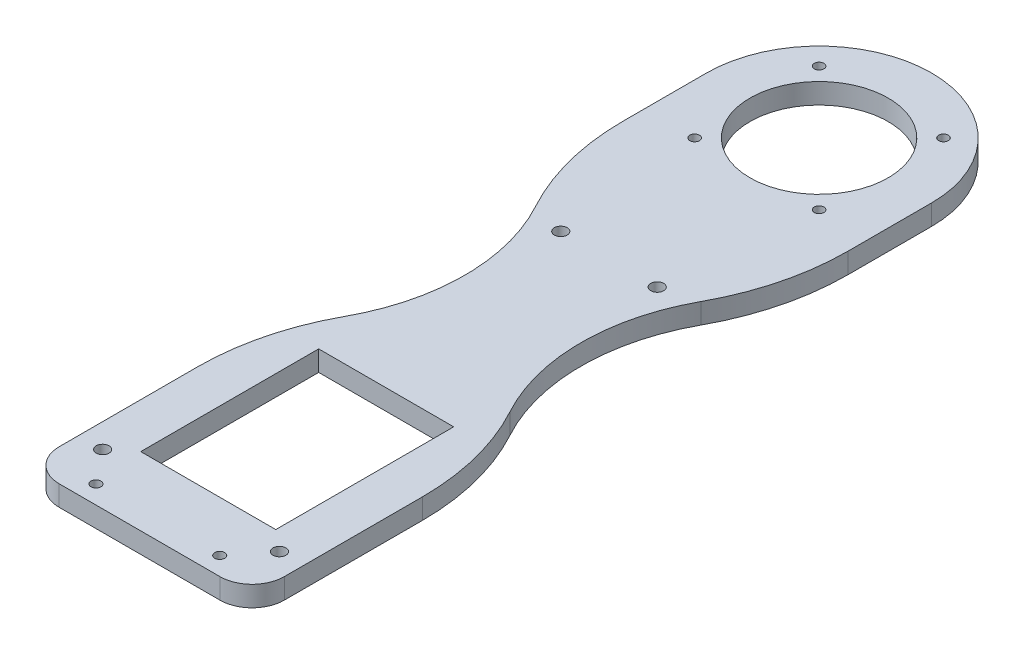
ISO-10303-21;
HEADER;
FILE_DESCRIPTION(('STEP AP214'),'2;1');
FILE_NAME('part.step','',(''),(''),'','','');
FILE_SCHEMA(('AUTOMOTIVE_DESIGN { 1 0 10303 214 1 1 1 1 }'));
ENDSEC;
DATA;
#1=APPLICATION_CONTEXT('core data for automotive mechanical design processes');
#2=APPLICATION_PROTOCOL_DEFINITION('international standard','automotive_design',2000,#1);
#3=PRODUCT_CONTEXT('',#1,'mechanical');
#4=PRODUCT('Part','Part','',(#3));
#5=PRODUCT_RELATED_PRODUCT_CATEGORY('part','',(#4));
#6=PRODUCT_DEFINITION_FORMATION('','',#4);
#7=PRODUCT_DEFINITION_CONTEXT('part definition',#1,'design');
#8=PRODUCT_DEFINITION('design','',#6,#7);
#9=PRODUCT_DEFINITION_SHAPE('','',#8);
#10=(LENGTH_UNIT() NAMED_UNIT(*) SI_UNIT(.MILLI.,.METRE.));
#11=(NAMED_UNIT(*) PLANE_ANGLE_UNIT() SI_UNIT($,.RADIAN.));
#12=(NAMED_UNIT(*) SI_UNIT($,.STERADIAN.) SOLID_ANGLE_UNIT());
#13=UNCERTAINTY_MEASURE_WITH_UNIT(LENGTH_MEASURE(1.E-05),#10,'distance_accuracy_value','');
#14=(GEOMETRIC_REPRESENTATION_CONTEXT(3) GLOBAL_UNCERTAINTY_ASSIGNED_CONTEXT((#13)) GLOBAL_UNIT_ASSIGNED_CONTEXT((#10,
#11,#12)) REPRESENTATION_CONTEXT('',''));
#15=CARTESIAN_POINT('',(0.,0.,0.));
#16=DIRECTION('',(0.,0.,1.));
#17=DIRECTION('',(1.,0.,0.));
#18=AXIS2_PLACEMENT_3D('',#15,#16,#17);
#19=CARTESIAN_POINT('',(0.,3.175,0.));
#20=DIRECTION('',(0.,1.,0.));
#21=DIRECTION('',(0.,0.,1.));
#22=AXIS2_PLACEMENT_3D('',#19,#20,#21);
#23=PLANE('',#22);
#24=CARTESIAN_POINT('',(-19.25,3.175,205.675));
#25=DIRECTION('',(0.,1.,0.));
#26=DIRECTION('',(0.,0.,1.));
#27=AXIS2_PLACEMENT_3D('',#24,#25,#26);
#28=CIRCLE('',#27,1.55);
#29=CARTESIAN_POINT('',(-19.25,3.175,207.225));
#30=VERTEX_POINT('',#29);
#31=EDGE_CURVE('E357',#30,#30,#28,.T.);
#32=ORIENTED_EDGE('',*,*,#31,.F.);
#33=EDGE_LOOP('',(#32));
#34=FACE_BOUND('',#33,.T.);
#35=CARTESIAN_POINT('',(19.25,3.175,205.675));
#36=DIRECTION('',(0.,1.,0.));
#37=DIRECTION('',(0.,0.,1.));
#38=AXIS2_PLACEMENT_3D('',#35,#36,#37);
#39=CIRCLE('',#38,1.55);
#40=CARTESIAN_POINT('',(19.25,3.175,207.225));
#41=VERTEX_POINT('',#40);
#42=EDGE_CURVE('E365',#41,#41,#39,.T.);
#43=ORIENTED_EDGE('',*,*,#42,.F.);
#44=EDGE_LOOP('',(#43));
#45=FACE_BOUND('',#44,.T.);
#46=CARTESIAN_POINT('',(-27.5,3.175,195.350000000001));
#47=DIRECTION('',(0.,1.,0.));
#48=DIRECTION('',(0.,0.,1.));
#49=AXIS2_PLACEMENT_3D('',#46,#47,#48);
#50=CIRCLE('',#49,2.00000000000001);
#51=CARTESIAN_POINT('',(-27.5,3.175,197.350000000001));
#52=VERTEX_POINT('',#51);
#53=EDGE_CURVE('E385',#52,#52,#50,.T.);
#54=ORIENTED_EDGE('',*,*,#53,.F.);
#55=EDGE_LOOP('',(#54));
#56=FACE_BOUND('',#55,.T.);
#57=CARTESIAN_POINT('',(27.5,3.175,195.350000000001));
#58=DIRECTION('',(0.,1.,0.));
#59=DIRECTION('',(0.,0.,1.));
#60=AXIS2_PLACEMENT_3D('',#57,#58,#59);
#61=CIRCLE('',#60,2.00000000000001);
#62=CARTESIAN_POINT('',(27.5,3.175,197.350000000001));
#63=VERTEX_POINT('',#62);
#64=EDGE_CURVE('E402',#63,#63,#61,.T.);
#65=ORIENTED_EDGE('',*,*,#64,.F.);
#66=EDGE_LOOP('',(#65));
#67=FACE_BOUND('',#66,.T.);
#68=CARTESIAN_POINT('',(-15.,3.175,65.3500000000007));
#69=DIRECTION('',(0.,1.,0.));
#70=DIRECTION('',(0.,0.,1.));
#71=AXIS2_PLACEMENT_3D('',#68,#69,#70);
#72=CIRCLE('',#71,2.);
#73=CARTESIAN_POINT('',(-15.,3.175,67.3500000000007));
#74=VERTEX_POINT('',#73);
#75=EDGE_CURVE('E394',#74,#74,#72,.T.);
#76=ORIENTED_EDGE('',*,*,#75,.F.);
#77=EDGE_LOOP('',(#76));
#78=FACE_BOUND('',#77,.T.);
#79=CARTESIAN_POINT('',(15.,3.175,65.3500000000007));
#80=DIRECTION('',(0.,1.,0.));
#81=DIRECTION('',(0.,0.,1.));
#82=AXIS2_PLACEMENT_3D('',#79,#80,#81);
#83=CIRCLE('',#82,2.00000000000001);
#84=CARTESIAN_POINT('',(15.,3.175,67.3500000000007));
#85=VERTEX_POINT('',#84);
#86=EDGE_CURVE('E393',#85,#85,#83,.T.);
#87=ORIENTED_EDGE('',*,*,#86,.F.);
#88=EDGE_LOOP('',(#87));
#89=FACE_BOUND('',#88,.T.);
#90=CARTESIAN_POINT('',(-19.35,3.175,-19.35));
#91=DIRECTION('',(0.,-1.,0.));
#92=DIRECTION('',(0.,0.,-1.));
#93=AXIS2_PLACEMENT_3D('',#90,#91,#92);
#94=CIRCLE('',#93,1.5);
#95=CARTESIAN_POINT('',(-19.35,3.175,-20.85));
#96=VERTEX_POINT('',#95);
#97=EDGE_CURVE('E437',#96,#96,#94,.T.);
#98=ORIENTED_EDGE('',*,*,#97,.T.);
#99=EDGE_LOOP('',(#98));
#100=FACE_BOUND('',#99,.T.);
#101=CARTESIAN_POINT('',(19.35,3.175,-19.35));
#102=DIRECTION('',(0.,-1.,0.));
#103=DIRECTION('',(0.,0.,-1.));
#104=AXIS2_PLACEMENT_3D('',#101,#102,#103);
#105=CIRCLE('',#104,1.5);
#106=CARTESIAN_POINT('',(19.35,3.175,-20.85));
#107=VERTEX_POINT('',#106);
#108=EDGE_CURVE('E429',#107,#107,#105,.T.);
#109=ORIENTED_EDGE('',*,*,#108,.T.);
#110=EDGE_LOOP('',(#109));
#111=FACE_BOUND('',#110,.T.);
#112=CARTESIAN_POINT('',(19.35,3.175,19.35));
#113=DIRECTION('',(0.,-1.,0.));
#114=DIRECTION('',(0.,0.,-1.));
#115=AXIS2_PLACEMENT_3D('',#112,#113,#114);
#116=CIRCLE('',#115,1.5);
#117=CARTESIAN_POINT('',(19.35,3.175,17.85));
#118=VERTEX_POINT('',#117);
#119=EDGE_CURVE('E421',#118,#118,#116,.T.);
#120=ORIENTED_EDGE('',*,*,#119,.T.);
#121=EDGE_LOOP('',(#120));
#122=FACE_BOUND('',#121,.T.);
#123=CARTESIAN_POINT('',(-19.35,3.175,19.35));
#124=DIRECTION('',(0.,-1.,0.));
#125=DIRECTION('',(0.,0.,-1.));
#126=AXIS2_PLACEMENT_3D('',#123,#124,#125);
#127=CIRCLE('',#126,1.5);
#128=CARTESIAN_POINT('',(-19.35,3.175,17.85));
#129=VERTEX_POINT('',#128);
#130=EDGE_CURVE('E215',#129,#129,#127,.T.);
#131=ORIENTED_EDGE('',*,*,#130,.T.);
#132=EDGE_LOOP('',(#131));
#133=FACE_BOUND('',#132,.T.);
#134=CARTESIAN_POINT('',(0.,3.175,0.));
#135=DIRECTION('',(0.,1.,0.));
#136=DIRECTION('',(0.,0.,1.));
#137=AXIS2_PLACEMENT_3D('',#134,#135,#136);
#138=CIRCLE('',#137,21.5);
#139=CARTESIAN_POINT('',(0.,3.175,21.5));
#140=VERTEX_POINT('',#139);
#141=EDGE_CURVE('E224',#140,#140,#138,.T.);
#142=ORIENTED_EDGE('',*,*,#141,.F.);
#143=EDGE_LOOP('',(#142));
#144=FACE_BOUND('',#143,.T.);
#145=DIRECTION('',(-1.,0.,0.));
#146=VECTOR('',#145,1.);
#147=CARTESIAN_POINT('',(0.,3.175,190.));
#148=LINE('',#147,#146);
#149=CARTESIAN_POINT('',(21.,3.175,190.));
#150=VERTEX_POINT('',#149);
#151=CARTESIAN_POINT('',(-21.,3.175,190.));
#152=VERTEX_POINT('',#151);
#153=EDGE_CURVE('E214',#150,#152,#148,.T.);
#154=ORIENTED_EDGE('',*,*,#153,.T.);
#155=DIRECTION('',(0.,0.,-1.));
#156=VECTOR('',#155,1.);
#157=CARTESIAN_POINT('',(-21.,3.175,0.));
#158=LINE('',#157,#156);
#159=CARTESIAN_POINT('',(-21.,3.175,134.65));
#160=VERTEX_POINT('',#159);
#161=EDGE_CURVE('E189',#152,#160,#158,.T.);
#162=ORIENTED_EDGE('',*,*,#161,.T.);
#163=DIRECTION('',(-1.,0.,0.));
#164=VECTOR('',#163,1.);
#165=CARTESIAN_POINT('',(0.,3.175,134.65));
#166=LINE('',#165,#164);
#167=CARTESIAN_POINT('',(21.,3.175,134.65));
#168=VERTEX_POINT('',#167);
#169=EDGE_CURVE('E198',#168,#160,#166,.T.);
#170=ORIENTED_EDGE('',*,*,#169,.F.);
#171=DIRECTION('',(0.,0.,-1.));
#172=VECTOR('',#171,1.);
#173=CARTESIAN_POINT('',(21.,3.175,0.));
#174=LINE('',#173,#172);
#175=EDGE_CURVE('E202',#150,#168,#174,.T.);
#176=ORIENTED_EDGE('',*,*,#175,.F.);
#177=EDGE_LOOP('',(#154,#162,#170,#176));
#178=FACE_BOUND('',#177,.T.);
#179=DIRECTION('',(0.,0.,1.));
#180=VECTOR('',#179,1.);
#181=CARTESIAN_POINT('',(-35.,3.175,0.));
#182=LINE('',#181,#180);
#183=CARTESIAN_POINT('',(-35.,3.175,0.));
#184=VERTEX_POINT('',#183);
#185=CARTESIAN_POINT('',(-35.,3.175,26.0091806341473));
#186=VERTEX_POINT('',#185);
#187=EDGE_CURVE('E244',#184,#186,#182,.T.);
#188=ORIENTED_EDGE('',*,*,#187,.T.);
#189=CARTESIAN_POINT('',(41.,3.175,26.0091806341473));
#190=DIRECTION('',(0.,1.,0.));
#191=DIRECTION('',(0.,0.,1.));
#192=AXIS2_PLACEMENT_3D('',#189,#190,#191);
#193=CIRCLE('',#192,76.);
#194=CARTESIAN_POINT('',(-25.6874106304796,3.175,62.4617424563539));
#195=VERTEX_POINT('',#194);
#196=EDGE_CURVE('E322',#186,#195,#193,.T.);
#197=ORIENTED_EDGE('',*,*,#196,.T.);
#198=CARTESIAN_POINT('',(-80.,3.175,92.15));
#199=DIRECTION('',(0.,1.,0.));
#200=DIRECTION('',(0.,0.,1.));
#201=AXIS2_PLACEMENT_3D('',#198,#199,#200);
#202=CIRCLE('',#201,61.8970920156997);
#203=CARTESIAN_POINT('',(-25.6874106304796,3.175,121.838257543646));
#204=VERTEX_POINT('',#203);
#205=EDGE_CURVE('E377',#204,#195,#202,.T.);
#206=ORIENTED_EDGE('',*,*,#205,.F.);
#207=CARTESIAN_POINT('',(41.,3.175,158.290819365853));
#208=DIRECTION('',(0.,1.,0.));
#209=DIRECTION('',(0.,0.,1.));
#210=AXIS2_PLACEMENT_3D('',#207,#208,#209);
#211=CIRCLE('',#210,76.);
#212=CARTESIAN_POINT('',(-35.,3.175,158.290819365853));
#213=VERTEX_POINT('',#212);
#214=EDGE_CURVE('E319',#204,#213,#211,.T.);
#215=ORIENTED_EDGE('',*,*,#214,.T.);
#216=CARTESIAN_POINT('',(-35.,3.175,201.35));
#217=VERTEX_POINT('',#216);
#218=EDGE_CURVE('E242',#213,#217,#182,.T.);
#219=ORIENTED_EDGE('',*,*,#218,.T.);
#220=CARTESIAN_POINT('',(-25.,3.175,201.35));
#221=DIRECTION('',(0.,1.,0.));
#222=DIRECTION('',(0.,0.,1.));
#223=AXIS2_PLACEMENT_3D('',#220,#221,#222);
#224=CIRCLE('',#223,10.);
#225=CARTESIAN_POINT('',(-25.,3.175,211.35));
#226=VERTEX_POINT('',#225);
#227=EDGE_CURVE('E302',#217,#226,#224,.T.);
#228=ORIENTED_EDGE('',*,*,#227,.T.);
#229=DIRECTION('',(1.,0.,0.));
#230=VECTOR('',#229,1.);
#231=CARTESIAN_POINT('',(0.,3.175,211.35));
#232=LINE('',#231,#230);
#233=CARTESIAN_POINT('',(25.,3.175,211.35));
#234=VERTEX_POINT('',#233);
#235=EDGE_CURVE('E248',#226,#234,#232,.T.);
#236=ORIENTED_EDGE('',*,*,#235,.T.);
#237=CARTESIAN_POINT('',(25.,3.175,201.35));
#238=DIRECTION('',(0.,1.,0.));
#239=DIRECTION('',(0.,0.,1.));
#240=AXIS2_PLACEMENT_3D('',#237,#238,#239);
#241=CIRCLE('',#240,10.);
#242=CARTESIAN_POINT('',(35.,3.175,201.35));
#243=VERTEX_POINT('',#242);
#244=EDGE_CURVE('E299',#234,#243,#241,.T.);
#245=ORIENTED_EDGE('',*,*,#244,.T.);
#246=DIRECTION('',(0.,0.,-1.));
#247=VECTOR('',#246,1.);
#248=CARTESIAN_POINT('',(35.,3.175,0.));
#249=LINE('',#248,#247);
#250=CARTESIAN_POINT('',(35.,3.175,158.290819365853));
#251=VERTEX_POINT('',#250);
#252=EDGE_CURVE('E253',#243,#251,#249,.T.);
#253=ORIENTED_EDGE('',*,*,#252,.T.);
#254=CARTESIAN_POINT('',(-41.,3.175,158.290819365853));
#255=DIRECTION('',(0.,1.,0.));
#256=DIRECTION('',(0.,0.,1.));
#257=AXIS2_PLACEMENT_3D('',#254,#255,#256);
#258=CIRCLE('',#257,76.);
#259=CARTESIAN_POINT('',(25.6874106304796,3.175,121.838257543646));
#260=VERTEX_POINT('',#259);
#261=EDGE_CURVE('E313',#251,#260,#258,.T.);
#262=ORIENTED_EDGE('',*,*,#261,.T.);
#263=CARTESIAN_POINT('',(80.,3.175,92.15));
#264=DIRECTION('',(0.,-1.,0.));
#265=DIRECTION('',(0.,0.,1.));
#266=AXIS2_PLACEMENT_3D('',#263,#264,#265);
#267=CIRCLE('',#266,61.8970920156997);
#268=CARTESIAN_POINT('',(25.6874106304796,3.175,62.4617424563539));
#269=VERTEX_POINT('',#268);
#270=EDGE_CURVE('E363',#260,#269,#267,.T.);
#271=ORIENTED_EDGE('',*,*,#270,.T.);
#272=CARTESIAN_POINT('',(-41.,3.175,26.0091806341473));
#273=DIRECTION('',(0.,1.,0.));
#274=DIRECTION('',(0.,0.,1.));
#275=AXIS2_PLACEMENT_3D('',#272,#273,#274);
#276=CIRCLE('',#275,76.);
#277=CARTESIAN_POINT('',(35.,3.175,26.0091806341473));
#278=VERTEX_POINT('',#277);
#279=EDGE_CURVE('E316',#269,#278,#276,.T.);
#280=ORIENTED_EDGE('',*,*,#279,.T.);
#281=CARTESIAN_POINT('',(35.,3.175,0.));
#282=VERTEX_POINT('',#281);
#283=EDGE_CURVE('E252',#278,#282,#249,.T.);
#284=ORIENTED_EDGE('',*,*,#283,.T.);
#285=CARTESIAN_POINT('',(0.,3.175,0.));
#286=DIRECTION('',(0.,1.,0.));
#287=DIRECTION('',(0.,0.,1.));
#288=AXIS2_PLACEMENT_3D('',#285,#286,#287);
#289=CIRCLE('',#288,35.);
#290=EDGE_CURVE('E238',#282,#184,#289,.T.);
#291=ORIENTED_EDGE('',*,*,#290,.T.);
#292=EDGE_LOOP('',(#188,#197,#206,#215,#219,#228,#236,#245,#253,#262,#271,#280,#284,#291));
#293=FACE_BOUND('',#292,.T.);
#294=ADVANCED_FACE('F41',(#34,#45,#56,#67,#78,#89,#100,#111,#122,#133,#144,#178,#293),#23,.T.);
#295=CARTESIAN_POINT('',(0.,-3.175,0.));
#296=DIRECTION('',(0.,1.,0.));
#297=DIRECTION('',(0.,0.,1.));
#298=AXIS2_PLACEMENT_3D('',#295,#296,#297);
#299=PLANE('',#298);
#300=CARTESIAN_POINT('',(-19.25,-3.175,205.675));
#301=DIRECTION('',(0.,1.,0.));
#302=DIRECTION('',(0.,0.,1.));
#303=AXIS2_PLACEMENT_3D('',#300,#301,#302);
#304=CIRCLE('',#303,1.55);
#305=CARTESIAN_POINT('',(-19.25,-3.175,207.225));
#306=VERTEX_POINT('',#305);
#307=EDGE_CURVE('E45',#306,#306,#304,.T.);
#308=ORIENTED_EDGE('',*,*,#307,.T.);
#309=EDGE_LOOP('',(#308));
#310=FACE_BOUND('',#309,.T.);
#311=CARTESIAN_POINT('',(19.25,-3.175,205.675));
#312=DIRECTION('',(0.,1.,0.));
#313=DIRECTION('',(0.,0.,1.));
#314=AXIS2_PLACEMENT_3D('',#311,#312,#313);
#315=CIRCLE('',#314,1.55);
#316=CARTESIAN_POINT('',(19.25,-3.175,207.225));
#317=VERTEX_POINT('',#316);
#318=EDGE_CURVE('E354',#317,#317,#315,.T.);
#319=ORIENTED_EDGE('',*,*,#318,.T.);
#320=EDGE_LOOP('',(#319));
#321=FACE_BOUND('',#320,.T.);
#322=DIRECTION('',(0.,0.,-1.));
#323=VECTOR('',#322,1.);
#324=CARTESIAN_POINT('',(-21.,-3.175,0.));
#325=LINE('',#324,#323);
#326=CARTESIAN_POINT('',(-21.,-3.175,190.));
#327=VERTEX_POINT('',#326);
#328=CARTESIAN_POINT('',(-21.,-3.175,134.65));
#329=VERTEX_POINT('',#328);
#330=EDGE_CURVE('E183',#327,#329,#325,.T.);
#331=ORIENTED_EDGE('',*,*,#330,.F.);
#332=DIRECTION('',(-1.,0.,0.));
#333=VECTOR('',#332,1.);
#334=CARTESIAN_POINT('',(0.,-3.175,190.));
#335=LINE('',#334,#333);
#336=CARTESIAN_POINT('',(21.,-3.175,190.));
#337=VERTEX_POINT('',#336);
#338=EDGE_CURVE('E171',#337,#327,#335,.T.);
#339=ORIENTED_EDGE('',*,*,#338,.F.);
#340=DIRECTION('',(0.,0.,-1.));
#341=VECTOR('',#340,1.);
#342=CARTESIAN_POINT('',(21.,-3.175,0.));
#343=LINE('',#342,#341);
#344=CARTESIAN_POINT('',(21.,-3.175,134.65));
#345=VERTEX_POINT('',#344);
#346=EDGE_CURVE('E182',#337,#345,#343,.T.);
#347=ORIENTED_EDGE('',*,*,#346,.T.);
#348=DIRECTION('',(-1.,0.,0.));
#349=VECTOR('',#348,1.);
#350=CARTESIAN_POINT('',(0.,-3.175,134.65));
#351=LINE('',#350,#349);
#352=EDGE_CURVE('E191',#345,#329,#351,.T.);
#353=ORIENTED_EDGE('',*,*,#352,.T.);
#354=EDGE_LOOP('',(#331,#339,#347,#353));
#355=FACE_BOUND('',#354,.T.);
#356=CARTESIAN_POINT('',(0.,-3.175,0.));
#357=DIRECTION('',(0.,1.,0.));
#358=DIRECTION('',(0.,0.,1.));
#359=AXIS2_PLACEMENT_3D('',#356,#357,#358);
#360=CIRCLE('',#359,21.5);
#361=CARTESIAN_POINT('',(0.,-3.175,21.5));
#362=VERTEX_POINT('',#361);
#363=EDGE_CURVE('E230',#362,#362,#360,.T.);
#364=ORIENTED_EDGE('',*,*,#363,.T.);
#365=EDGE_LOOP('',(#364));
#366=FACE_BOUND('',#365,.T.);
#367=CARTESIAN_POINT('',(-19.35,-3.175,19.35));
#368=DIRECTION('',(0.,-1.,0.));
#369=DIRECTION('',(0.,0.,-1.));
#370=AXIS2_PLACEMENT_3D('',#367,#368,#369);
#371=CIRCLE('',#370,1.5);
#372=CARTESIAN_POINT('',(-19.35,-3.175,17.85));
#373=VERTEX_POINT('',#372);
#374=EDGE_CURVE('E205',#373,#373,#371,.T.);
#375=ORIENTED_EDGE('',*,*,#374,.F.);
#376=EDGE_LOOP('',(#375));
#377=FACE_BOUND('',#376,.T.);
#378=CARTESIAN_POINT('',(19.35,-3.175,19.35));
#379=DIRECTION('',(0.,-1.,0.));
#380=DIRECTION('',(0.,0.,-1.));
#381=AXIS2_PLACEMENT_3D('',#378,#379,#380);
#382=CIRCLE('',#381,1.5);
#383=CARTESIAN_POINT('',(19.35,-3.175,17.85));
#384=VERTEX_POINT('',#383);
#385=EDGE_CURVE('E425',#384,#384,#382,.T.);
#386=ORIENTED_EDGE('',*,*,#385,.F.);
#387=EDGE_LOOP('',(#386));
#388=FACE_BOUND('',#387,.T.);
#389=CARTESIAN_POINT('',(19.35,-3.175,-19.35));
#390=DIRECTION('',(0.,-1.,0.));
#391=DIRECTION('',(0.,0.,-1.));
#392=AXIS2_PLACEMENT_3D('',#389,#390,#391);
#393=CIRCLE('',#392,1.5);
#394=CARTESIAN_POINT('',(19.35,-3.175,-20.85));
#395=VERTEX_POINT('',#394);
#396=EDGE_CURVE('E433',#395,#395,#393,.T.);
#397=ORIENTED_EDGE('',*,*,#396,.F.);
#398=EDGE_LOOP('',(#397));
#399=FACE_BOUND('',#398,.T.);
#400=CARTESIAN_POINT('',(-19.35,-3.175,-19.35));
#401=DIRECTION('',(0.,-1.,0.));
#402=DIRECTION('',(0.,0.,-1.));
#403=AXIS2_PLACEMENT_3D('',#400,#401,#402);
#404=CIRCLE('',#403,1.5);
#405=CARTESIAN_POINT('',(-19.35,-3.175,-20.85));
#406=VERTEX_POINT('',#405);
#407=EDGE_CURVE('E417',#406,#406,#404,.T.);
#408=ORIENTED_EDGE('',*,*,#407,.F.);
#409=EDGE_LOOP('',(#408));
#410=FACE_BOUND('',#409,.T.);
#411=CARTESIAN_POINT('',(15.,-3.175,65.3500000000007));
#412=DIRECTION('',(0.,1.,0.));
#413=DIRECTION('',(0.,0.,1.));
#414=AXIS2_PLACEMENT_3D('',#411,#412,#413);
#415=CIRCLE('',#414,2.00000000000001);
#416=CARTESIAN_POINT('',(15.,-3.175,67.3500000000007));
#417=VERTEX_POINT('',#416);
#418=EDGE_CURVE('E413',#417,#417,#415,.T.);
#419=ORIENTED_EDGE('',*,*,#418,.T.);
#420=EDGE_LOOP('',(#419));
#421=FACE_BOUND('',#420,.T.);
#422=CARTESIAN_POINT('',(-15.,-3.175,65.3500000000007));
#423=DIRECTION('',(0.,1.,0.));
#424=DIRECTION('',(0.,0.,1.));
#425=AXIS2_PLACEMENT_3D('',#422,#423,#424);
#426=CIRCLE('',#425,2.);
#427=CARTESIAN_POINT('',(-15.,-3.175,67.3500000000007));
#428=VERTEX_POINT('',#427);
#429=EDGE_CURVE('E389',#428,#428,#426,.T.);
#430=ORIENTED_EDGE('',*,*,#429,.T.);
#431=EDGE_LOOP('',(#430));
#432=FACE_BOUND('',#431,.T.);
#433=CARTESIAN_POINT('',(27.5,-3.175,195.350000000001));
#434=DIRECTION('',(0.,1.,0.));
#435=DIRECTION('',(0.,0.,1.));
#436=AXIS2_PLACEMENT_3D('',#433,#434,#435);
#437=CIRCLE('',#436,2.00000000000001);
#438=CARTESIAN_POINT('',(27.5,-3.175,197.350000000001));
#439=VERTEX_POINT('',#438);
#440=EDGE_CURVE('E398',#439,#439,#437,.T.);
#441=ORIENTED_EDGE('',*,*,#440,.T.);
#442=EDGE_LOOP('',(#441));
#443=FACE_BOUND('',#442,.T.);
#444=CARTESIAN_POINT('',(-27.5,-3.175,195.350000000001));
#445=DIRECTION('',(0.,1.,0.));
#446=DIRECTION('',(0.,0.,1.));
#447=AXIS2_PLACEMENT_3D('',#444,#445,#446);
#448=CIRCLE('',#447,2.00000000000001);
#449=CARTESIAN_POINT('',(-27.5,-3.175,197.350000000001));
#450=VERTEX_POINT('',#449);
#451=EDGE_CURVE('E406',#450,#450,#448,.T.);
#452=ORIENTED_EDGE('',*,*,#451,.T.);
#453=EDGE_LOOP('',(#452));
#454=FACE_BOUND('',#453,.T.);
#455=CARTESIAN_POINT('',(-80.,-3.175,92.15));
#456=DIRECTION('',(0.,1.,0.));
#457=DIRECTION('',(0.,0.,1.));
#458=AXIS2_PLACEMENT_3D('',#455,#456,#457);
#459=CIRCLE('',#458,61.8970920156997);
#460=CARTESIAN_POINT('',(-25.6874106304796,-3.175,121.838257543646));
#461=VERTEX_POINT('',#460);
#462=CARTESIAN_POINT('',(-25.6874106304796,-3.175,62.4617424563539));
#463=VERTEX_POINT('',#462);
#464=EDGE_CURVE('E381',#461,#463,#459,.T.);
#465=ORIENTED_EDGE('',*,*,#464,.T.);
#466=CARTESIAN_POINT('',(41.,-3.175,26.0091806341473));
#467=DIRECTION('',(0.,1.,0.));
#468=DIRECTION('',(0.,0.,1.));
#469=AXIS2_PLACEMENT_3D('',#466,#467,#468);
#470=CIRCLE('',#469,76.);
#471=CARTESIAN_POINT('',(-35.,-3.175,26.0091806341473));
#472=VERTEX_POINT('',#471);
#473=EDGE_CURVE('E341',#463,#472,#470,.F.);
#474=ORIENTED_EDGE('',*,*,#473,.T.);
#475=DIRECTION('',(0.,0.,1.));
#476=VECTOR('',#475,1.);
#477=CARTESIAN_POINT('',(-35.,-3.175,0.));
#478=LINE('',#477,#476);
#479=CARTESIAN_POINT('',(-35.,-3.175,0.));
#480=VERTEX_POINT('',#479);
#481=EDGE_CURVE('E262',#480,#472,#478,.T.);
#482=ORIENTED_EDGE('',*,*,#481,.F.);
#483=CARTESIAN_POINT('',(0.,-3.175,0.));
#484=DIRECTION('',(0.,1.,0.));
#485=DIRECTION('',(0.,0.,1.));
#486=AXIS2_PLACEMENT_3D('',#483,#484,#485);
#487=CIRCLE('',#486,35.);
#488=CARTESIAN_POINT('',(35.,-3.175,0.));
#489=VERTEX_POINT('',#488);
#490=EDGE_CURVE('E234',#489,#480,#487,.T.);
#491=ORIENTED_EDGE('',*,*,#490,.F.);
#492=DIRECTION('',(0.,0.,-1.));
#493=VECTOR('',#492,1.);
#494=CARTESIAN_POINT('',(35.,-3.175,0.));
#495=LINE('',#494,#493);
#496=CARTESIAN_POINT('',(35.,-3.175,26.0091806341473));
#497=VERTEX_POINT('',#496);
#498=EDGE_CURVE('E270',#497,#489,#495,.T.);
#499=ORIENTED_EDGE('',*,*,#498,.F.);
#500=CARTESIAN_POINT('',(-41.,-3.175,26.0091806341473));
#501=DIRECTION('',(0.,1.,0.));
#502=DIRECTION('',(0.,0.,1.));
#503=AXIS2_PLACEMENT_3D('',#500,#501,#502);
#504=CIRCLE('',#503,76.);
#505=CARTESIAN_POINT('',(25.6874106304796,-3.175,62.4617424563539));
#506=VERTEX_POINT('',#505);
#507=EDGE_CURVE('E335',#497,#506,#504,.F.);
#508=ORIENTED_EDGE('',*,*,#507,.T.);
#509=CARTESIAN_POINT('',(80.,-3.175,92.15));
#510=DIRECTION('',(0.,-1.,0.));
#511=DIRECTION('',(0.,0.,1.));
#512=AXIS2_PLACEMENT_3D('',#509,#510,#511);
#513=CIRCLE('',#512,61.8970920156997);
#514=CARTESIAN_POINT('',(25.6874106304796,-3.175,121.838257543646));
#515=VERTEX_POINT('',#514);
#516=EDGE_CURVE('E373',#515,#506,#513,.T.);
#517=ORIENTED_EDGE('',*,*,#516,.F.);
#518=CARTESIAN_POINT('',(-41.,-3.175,158.290819365853));
#519=DIRECTION('',(0.,1.,0.));
#520=DIRECTION('',(0.,0.,1.));
#521=AXIS2_PLACEMENT_3D('',#518,#519,#520);
#522=CIRCLE('',#521,76.);
#523=CARTESIAN_POINT('',(35.,-3.175,158.290819365853));
#524=VERTEX_POINT('',#523);
#525=EDGE_CURVE('E332',#515,#524,#522,.F.);
#526=ORIENTED_EDGE('',*,*,#525,.T.);
#527=CARTESIAN_POINT('',(35.,-3.175,201.35));
#528=VERTEX_POINT('',#527);
#529=EDGE_CURVE('E243',#528,#524,#495,.T.);
#530=ORIENTED_EDGE('',*,*,#529,.F.);
#531=CARTESIAN_POINT('',(25.,-3.175,201.35));
#532=DIRECTION('',(0.,1.,0.));
#533=DIRECTION('',(0.,0.,1.));
#534=AXIS2_PLACEMENT_3D('',#531,#532,#533);
#535=CIRCLE('',#534,10.);
#536=CARTESIAN_POINT('',(25.,-3.175,211.35));
#537=VERTEX_POINT('',#536);
#538=EDGE_CURVE('E288',#528,#537,#535,.F.);
#539=ORIENTED_EDGE('',*,*,#538,.T.);
#540=DIRECTION('',(1.,0.,0.));
#541=VECTOR('',#540,1.);
#542=CARTESIAN_POINT('',(0.,-3.175,211.35));
#543=LINE('',#542,#541);
#544=CARTESIAN_POINT('',(-25.,-3.175,211.35));
#545=VERTEX_POINT('',#544);
#546=EDGE_CURVE('E266',#545,#537,#543,.T.);
#547=ORIENTED_EDGE('',*,*,#546,.F.);
#548=CARTESIAN_POINT('',(-25.,-3.175,201.35));
#549=DIRECTION('',(0.,1.,0.));
#550=DIRECTION('',(0.,0.,1.));
#551=AXIS2_PLACEMENT_3D('',#548,#549,#550);
#552=CIRCLE('',#551,10.);
#553=CARTESIAN_POINT('',(-35.,-3.175,201.35));
#554=VERTEX_POINT('',#553);
#555=EDGE_CURVE('E291',#545,#554,#552,.F.);
#556=ORIENTED_EDGE('',*,*,#555,.T.);
#557=CARTESIAN_POINT('',(-35.,-3.175,158.290819365853));
#558=VERTEX_POINT('',#557);
#559=EDGE_CURVE('E261',#558,#554,#478,.T.);
#560=ORIENTED_EDGE('',*,*,#559,.F.);
#561=CARTESIAN_POINT('',(41.,-3.175,158.290819365853));
#562=DIRECTION('',(0.,1.,0.));
#563=DIRECTION('',(0.,0.,1.));
#564=AXIS2_PLACEMENT_3D('',#561,#562,#563);
#565=CIRCLE('',#564,76.);
#566=EDGE_CURVE('E338',#558,#461,#565,.F.);
#567=ORIENTED_EDGE('',*,*,#566,.T.);
#568=EDGE_LOOP('',(#465,#474,#482,#491,#499,#508,#517,#526,#530,#539,#547,#556,#560,#567));
#569=FACE_BOUND('',#568,.T.);
#570=ADVANCED_FACE('F194',(#310,#321,#355,#366,#377,#388,#399,#410,#421,#432,#443,#454,#569),
#299,.F.);
#571=CARTESIAN_POINT('',(35.,3.175,0.));
#572=DIRECTION('',(-1.,0.,0.));
#573=DIRECTION('',(0.,0.,1.));
#574=AXIS2_PLACEMENT_3D('',#571,#572,#573);
#575=PLANE('',#574);
#576=ORIENTED_EDGE('',*,*,#529,.T.);
#577=DIRECTION('',(0.,-1.,0.));
#578=VECTOR('',#577,1.);
#579=CARTESIAN_POINT('',(35.,3.175,158.290819365853));
#580=LINE('',#579,#578);
#581=EDGE_CURVE('E11',#524,#251,#580,.F.);
#582=ORIENTED_EDGE('',*,*,#581,.T.);
#583=ORIENTED_EDGE('',*,*,#252,.F.);
#584=DIRECTION('',(0.,-1.,0.));
#585=VECTOR('',#584,1.);
#586=CARTESIAN_POINT('',(35.,3.175,201.35));
#587=LINE('',#586,#585);
#588=EDGE_CURVE('E305',#243,#528,#587,.T.);
#589=ORIENTED_EDGE('',*,*,#588,.T.);
#590=EDGE_LOOP('',(#576,#582,#583,#589));
#591=FACE_BOUND('',#590,.T.);
#592=ADVANCED_FACE('F455',(#591),#575,.F.);
#593=ORIENTED_EDGE('',*,*,#283,.F.);
#594=DIRECTION('',(0.,-1.,0.));
#595=VECTOR('',#594,1.);
#596=CARTESIAN_POINT('',(35.,-3.175,26.0091806341473));
#597=LINE('',#596,#595);
#598=EDGE_CURVE('E51',#278,#497,#597,.T.);
#599=ORIENTED_EDGE('',*,*,#598,.T.);
#600=ORIENTED_EDGE('',*,*,#498,.T.);
#601=DIRECTION('',(0.,-1.,0.));
#602=VECTOR('',#601,1.);
#603=CARTESIAN_POINT('',(35.,3.175,0.));
#604=LINE('',#603,#602);
#605=EDGE_CURVE('E257',#282,#489,#604,.T.);
#606=ORIENTED_EDGE('',*,*,#605,.F.);
#607=EDGE_LOOP('',(#593,#599,#600,#606));
#608=FACE_BOUND('',#607,.T.);
#609=ADVANCED_FACE('F538',(#608),#575,.F.);
#610=CARTESIAN_POINT('',(-35.,3.175,0.));
#611=DIRECTION('',(1.,0.,0.));
#612=DIRECTION('',(0.,0.,-1.));
#613=AXIS2_PLACEMENT_3D('',#610,#611,#612);
#614=PLANE('',#613);
#615=ORIENTED_EDGE('',*,*,#481,.T.);
#616=DIRECTION('',(0.,1.,0.));
#617=VECTOR('',#616,1.);
#618=CARTESIAN_POINT('',(-35.,3.175,26.0091806341473));
#619=LINE('',#618,#617);
#620=EDGE_CURVE('E309',#472,#186,#619,.T.);
#621=ORIENTED_EDGE('',*,*,#620,.T.);
#622=ORIENTED_EDGE('',*,*,#187,.F.);
#623=DIRECTION('',(0.,-1.,0.));
#624=VECTOR('',#623,1.);
#625=CARTESIAN_POINT('',(-35.,3.175,0.));
#626=LINE('',#625,#624);
#627=EDGE_CURVE('E277',#184,#480,#626,.T.);
#628=ORIENTED_EDGE('',*,*,#627,.T.);
#629=EDGE_LOOP('',(#615,#621,#622,#628));
#630=FACE_BOUND('',#629,.T.);
#631=ADVANCED_FACE('F482',(#630),#614,.F.);
#632=CARTESIAN_POINT('',(0.,3.175,0.));
#633=DIRECTION('',(0.,-1.,0.));
#634=DIRECTION('',(0.,0.,-1.));
#635=AXIS2_PLACEMENT_3D('',#632,#633,#634);
#636=CYLINDRICAL_SURFACE('',#635,35.);
#637=ORIENTED_EDGE('',*,*,#490,.T.);
#638=ORIENTED_EDGE('',*,*,#627,.F.);
#639=ORIENTED_EDGE('',*,*,#290,.F.);
#640=ORIENTED_EDGE('',*,*,#605,.T.);
#641=EDGE_LOOP('',(#637,#638,#639,#640));
#642=FACE_BOUND('',#641,.T.);
#643=ADVANCED_FACE('F489',(#642),#636,.T.);
#644=ORIENTED_EDGE('',*,*,#218,.F.);
#645=DIRECTION('',(0.,1.,0.));
#646=VECTOR('',#645,1.);
#647=CARTESIAN_POINT('',(-35.,3.175,158.290819365853));
#648=LINE('',#647,#646);
#649=EDGE_CURVE('E66',#213,#558,#648,.F.);
#650=ORIENTED_EDGE('',*,*,#649,.T.);
#651=ORIENTED_EDGE('',*,*,#559,.T.);
#652=DIRECTION('',(0.,-1.,0.));
#653=VECTOR('',#652,1.);
#654=CARTESIAN_POINT('',(-35.,3.175,201.35));
#655=LINE('',#654,#653);
#656=EDGE_CURVE('E295',#554,#217,#655,.F.);
#657=ORIENTED_EDGE('',*,*,#656,.T.);
#658=EDGE_LOOP('',(#644,#650,#651,#657));
#659=FACE_BOUND('',#658,.T.);
#660=ADVANCED_FACE('F525',(#659),#614,.F.);
#661=CARTESIAN_POINT('',(0.,3.175,211.35));
#662=DIRECTION('',(0.,0.,-1.));
#663=DIRECTION('',(-1.,0.,0.));
#664=AXIS2_PLACEMENT_3D('',#661,#662,#663);
#665=PLANE('',#664);
#666=ORIENTED_EDGE('',*,*,#235,.F.);
#667=DIRECTION('',(0.,-1.,0.));
#668=VECTOR('',#667,1.);
#669=CARTESIAN_POINT('',(-25.,3.175,211.35));
#670=LINE('',#669,#668);
#671=EDGE_CURVE('E284',#226,#545,#670,.T.);
#672=ORIENTED_EDGE('',*,*,#671,.T.);
#673=ORIENTED_EDGE('',*,*,#546,.T.);
#674=DIRECTION('',(0.,-1.,0.));
#675=VECTOR('',#674,1.);
#676=CARTESIAN_POINT('',(25.,3.175,211.35));
#677=LINE('',#676,#675);
#678=EDGE_CURVE('E281',#537,#234,#677,.F.);
#679=ORIENTED_EDGE('',*,*,#678,.T.);
#680=EDGE_LOOP('',(#666,#672,#673,#679));
#681=FACE_BOUND('',#680,.T.);
#682=ADVANCED_FACE('F513',(#681),#665,.F.);
#683=CARTESIAN_POINT('',(0.,-3.175,0.));
#684=DIRECTION('',(0.,1.,0.));
#685=DIRECTION('',(0.,0.,1.));
#686=AXIS2_PLACEMENT_3D('',#683,#684,#685);
#687=CYLINDRICAL_SURFACE('',#686,21.5);
#688=ORIENTED_EDGE('',*,*,#363,.F.);
#689=EDGE_LOOP('',(#688));
#690=FACE_BOUND('',#689,.T.);
#691=ORIENTED_EDGE('',*,*,#141,.T.);
#692=EDGE_LOOP('',(#691));
#693=FACE_BOUND('',#692,.T.);
#694=ADVANCED_FACE('F534',(#690,#693),#687,.F.);
#695=CARTESIAN_POINT('',(-21.,-3.175,0.));
#696=DIRECTION('',(1.,0.,0.));
#697=DIRECTION('',(0.,0.,-1.));
#698=AXIS2_PLACEMENT_3D('',#695,#696,#697);
#699=PLANE('',#698);
#700=ORIENTED_EDGE('',*,*,#161,.F.);
#701=DIRECTION('',(0.,1.,0.));
#702=VECTOR('',#701,1.);
#703=CARTESIAN_POINT('',(-21.,-3.175,190.));
#704=LINE('',#703,#702);
#705=EDGE_CURVE('E175',#327,#152,#704,.T.);
#706=ORIENTED_EDGE('',*,*,#705,.F.);
#707=ORIENTED_EDGE('',*,*,#330,.T.);
#708=DIRECTION('',(0.,1.,0.));
#709=VECTOR('',#708,1.);
#710=CARTESIAN_POINT('',(-21.,-3.175,134.65));
#711=LINE('',#710,#709);
#712=EDGE_CURVE('E221',#329,#160,#711,.T.);
#713=ORIENTED_EDGE('',*,*,#712,.T.);
#714=EDGE_LOOP('',(#700,#706,#707,#713));
#715=FACE_BOUND('',#714,.T.);
#716=ADVANCED_FACE('F186',(#715),#699,.T.);
#717=CARTESIAN_POINT('',(0.,-3.175,134.65));
#718=DIRECTION('',(0.,0.,-1.));
#719=DIRECTION('',(-1.,0.,0.));
#720=AXIS2_PLACEMENT_3D('',#717,#718,#719);
#721=PLANE('',#720);
#722=ORIENTED_EDGE('',*,*,#169,.T.);
#723=ORIENTED_EDGE('',*,*,#712,.F.);
#724=ORIENTED_EDGE('',*,*,#352,.F.);
#725=DIRECTION('',(0.,1.,0.));
#726=VECTOR('',#725,1.);
#727=CARTESIAN_POINT('',(21.,-3.175,134.65));
#728=LINE('',#727,#726);
#729=EDGE_CURVE('E225',#345,#168,#728,.T.);
#730=ORIENTED_EDGE('',*,*,#729,.T.);
#731=EDGE_LOOP('',(#722,#723,#724,#730));
#732=FACE_BOUND('',#731,.T.);
#733=ADVANCED_FACE('F581',(#732),#721,.F.);
#734=CARTESIAN_POINT('',(21.,-3.175,0.));
#735=DIRECTION('',(1.,0.,0.));
#736=DIRECTION('',(0.,0.,-1.));
#737=AXIS2_PLACEMENT_3D('',#734,#735,#736);
#738=PLANE('',#737);
#739=ORIENTED_EDGE('',*,*,#175,.T.);
#740=ORIENTED_EDGE('',*,*,#729,.F.);
#741=ORIENTED_EDGE('',*,*,#346,.F.);
#742=DIRECTION('',(0.,1.,0.));
#743=VECTOR('',#742,1.);
#744=CARTESIAN_POINT('',(21.,-3.175,190.));
#745=LINE('',#744,#743);
#746=EDGE_CURVE('E177',#337,#150,#745,.T.);
#747=ORIENTED_EDGE('',*,*,#746,.T.);
#748=EDGE_LOOP('',(#739,#740,#741,#747));
#749=FACE_BOUND('',#748,.T.);
#750=ADVANCED_FACE('F589',(#749),#738,.F.);
#751=CARTESIAN_POINT('',(0.,-3.175,190.));
#752=DIRECTION('',(0.,0.,-1.));
#753=DIRECTION('',(-1.,0.,0.));
#754=AXIS2_PLACEMENT_3D('',#751,#752,#753);
#755=PLANE('',#754);
#756=ORIENTED_EDGE('',*,*,#153,.F.);
#757=ORIENTED_EDGE('',*,*,#746,.F.);
#758=ORIENTED_EDGE('',*,*,#338,.T.);
#759=ORIENTED_EDGE('',*,*,#705,.T.);
#760=EDGE_LOOP('',(#756,#757,#758,#759));
#761=FACE_BOUND('',#760,.T.);
#762=ADVANCED_FACE('F174',(#761),#755,.T.);
#763=CARTESIAN_POINT('',(-19.35,3.175,19.35));
#764=DIRECTION('',(0.,-1.,0.));
#765=DIRECTION('',(0.,0.,-1.));
#766=AXIS2_PLACEMENT_3D('',#763,#764,#765);
#767=CYLINDRICAL_SURFACE('',#766,1.5);
#768=ORIENTED_EDGE('',*,*,#130,.F.);
#769=EDGE_LOOP('',(#768));
#770=FACE_BOUND('',#769,.T.);
#771=ORIENTED_EDGE('',*,*,#374,.T.);
#772=EDGE_LOOP('',(#771));
#773=FACE_BOUND('',#772,.T.);
#774=ADVANCED_FACE('F451',(#770,#773),#767,.F.);
#775=CARTESIAN_POINT('',(19.35,3.175,19.35));
#776=DIRECTION('',(0.,-1.,0.));
#777=DIRECTION('',(0.,0.,-1.));
#778=AXIS2_PLACEMENT_3D('',#775,#776,#777);
#779=CYLINDRICAL_SURFACE('',#778,1.5);
#780=ORIENTED_EDGE('',*,*,#119,.F.);
#781=EDGE_LOOP('',(#780));
#782=FACE_BOUND('',#781,.T.);
#783=ORIENTED_EDGE('',*,*,#385,.T.);
#784=EDGE_LOOP('',(#783));
#785=FACE_BOUND('',#784,.T.);
#786=ADVANCED_FACE('F616',(#782,#785),#779,.F.);
#787=CARTESIAN_POINT('',(19.35,3.175,-19.35));
#788=DIRECTION('',(0.,-1.,0.));
#789=DIRECTION('',(0.,0.,-1.));
#790=AXIS2_PLACEMENT_3D('',#787,#788,#789);
#791=CYLINDRICAL_SURFACE('',#790,1.5);
#792=ORIENTED_EDGE('',*,*,#108,.F.);
#793=EDGE_LOOP('',(#792));
#794=FACE_BOUND('',#793,.T.);
#795=ORIENTED_EDGE('',*,*,#396,.T.);
#796=EDGE_LOOP('',(#795));
#797=FACE_BOUND('',#796,.T.);
#798=ADVANCED_FACE('F626',(#794,#797),#791,.F.);
#799=CARTESIAN_POINT('',(-19.35,3.175,-19.35));
#800=DIRECTION('',(0.,-1.,0.));
#801=DIRECTION('',(0.,0.,-1.));
#802=AXIS2_PLACEMENT_3D('',#799,#800,#801);
#803=CYLINDRICAL_SURFACE('',#802,1.5);
#804=ORIENTED_EDGE('',*,*,#97,.F.);
#805=EDGE_LOOP('',(#804));
#806=FACE_BOUND('',#805,.T.);
#807=ORIENTED_EDGE('',*,*,#407,.T.);
#808=EDGE_LOOP('',(#807));
#809=FACE_BOUND('',#808,.T.);
#810=ADVANCED_FACE('F636',(#806,#809),#803,.F.);
#811=CARTESIAN_POINT('',(-25.,3.175,201.35));
#812=DIRECTION('',(0.,-1.,0.));
#813=DIRECTION('',(0.,0.,-1.));
#814=AXIS2_PLACEMENT_3D('',#811,#812,#813);
#815=CYLINDRICAL_SURFACE('',#814,10.);
#816=ORIENTED_EDGE('',*,*,#227,.F.);
#817=ORIENTED_EDGE('',*,*,#656,.F.);
#818=ORIENTED_EDGE('',*,*,#555,.F.);
#819=ORIENTED_EDGE('',*,*,#671,.F.);
#820=EDGE_LOOP('',(#816,#817,#818,#819));
#821=FACE_BOUND('',#820,.T.);
#822=ADVANCED_FACE('F519',(#821),#815,.T.);
#823=CARTESIAN_POINT('',(25.,3.175,201.35));
#824=DIRECTION('',(0.,-1.,0.));
#825=DIRECTION('',(0.,0.,-1.));
#826=AXIS2_PLACEMENT_3D('',#823,#824,#825);
#827=CYLINDRICAL_SURFACE('',#826,10.);
#828=ORIENTED_EDGE('',*,*,#244,.F.);
#829=ORIENTED_EDGE('',*,*,#678,.F.);
#830=ORIENTED_EDGE('',*,*,#538,.F.);
#831=ORIENTED_EDGE('',*,*,#588,.F.);
#832=EDGE_LOOP('',(#828,#829,#830,#831));
#833=FACE_BOUND('',#832,.T.);
#834=ADVANCED_FACE('F516',(#833),#827,.T.);
#835=CARTESIAN_POINT('',(15.,-3.175,65.3500000000007));
#836=DIRECTION('',(0.,1.,0.));
#837=DIRECTION('',(0.,0.,1.));
#838=AXIS2_PLACEMENT_3D('',#835,#836,#837);
#839=CYLINDRICAL_SURFACE('',#838,2.00000000000001);
#840=ORIENTED_EDGE('',*,*,#418,.F.);
#841=EDGE_LOOP('',(#840));
#842=FACE_BOUND('',#841,.T.);
#843=ORIENTED_EDGE('',*,*,#86,.T.);
#844=EDGE_LOOP('',(#843));
#845=FACE_BOUND('',#844,.T.);
#846=ADVANCED_FACE('F668',(#842,#845),#839,.F.);
#847=CARTESIAN_POINT('',(-15.,-3.175,65.3500000000007));
#848=DIRECTION('',(0.,1.,0.));
#849=DIRECTION('',(0.,0.,1.));
#850=AXIS2_PLACEMENT_3D('',#847,#848,#849);
#851=CYLINDRICAL_SURFACE('',#850,2.);
#852=ORIENTED_EDGE('',*,*,#429,.F.);
#853=EDGE_LOOP('',(#852));
#854=FACE_BOUND('',#853,.T.);
#855=ORIENTED_EDGE('',*,*,#75,.T.);
#856=EDGE_LOOP('',(#855));
#857=FACE_BOUND('',#856,.T.);
#858=ADVANCED_FACE('F677',(#854,#857),#851,.F.);
#859=CARTESIAN_POINT('',(27.5,-3.175,195.350000000001));
#860=DIRECTION('',(0.,1.,0.));
#861=DIRECTION('',(0.,0.,1.));
#862=AXIS2_PLACEMENT_3D('',#859,#860,#861);
#863=CYLINDRICAL_SURFACE('',#862,2.00000000000001);
#864=ORIENTED_EDGE('',*,*,#440,.F.);
#865=EDGE_LOOP('',(#864));
#866=FACE_BOUND('',#865,.T.);
#867=ORIENTED_EDGE('',*,*,#64,.T.);
#868=EDGE_LOOP('',(#867));
#869=FACE_BOUND('',#868,.T.);
#870=ADVANCED_FACE('F687',(#866,#869),#863,.F.);
#871=CARTESIAN_POINT('',(-27.5,-3.175,195.350000000001));
#872=DIRECTION('',(0.,1.,0.));
#873=DIRECTION('',(0.,0.,1.));
#874=AXIS2_PLACEMENT_3D('',#871,#872,#873);
#875=CYLINDRICAL_SURFACE('',#874,2.00000000000001);
#876=ORIENTED_EDGE('',*,*,#451,.F.);
#877=EDGE_LOOP('',(#876));
#878=FACE_BOUND('',#877,.T.);
#879=ORIENTED_EDGE('',*,*,#53,.T.);
#880=EDGE_LOOP('',(#879));
#881=FACE_BOUND('',#880,.T.);
#882=ADVANCED_FACE('F697',(#878,#881),#875,.F.);
#883=CARTESIAN_POINT('',(-80.,-3.175,92.15));
#884=DIRECTION('',(0.,1.,0.));
#885=DIRECTION('',(0.,0.,1.));
#886=AXIS2_PLACEMENT_3D('',#883,#884,#885);
#887=CYLINDRICAL_SURFACE('',#886,61.8970920156997);
#888=ORIENTED_EDGE('',*,*,#205,.T.);
#889=DIRECTION('',(0.,1.,0.));
#890=VECTOR('',#889,1.);
#891=CARTESIAN_POINT('',(-25.6874106304796,-3.175,62.4617424563539));
#892=LINE('',#891,#890);
#893=EDGE_CURVE('E329',#195,#463,#892,.F.);
#894=ORIENTED_EDGE('',*,*,#893,.T.);
#895=ORIENTED_EDGE('',*,*,#464,.F.);
#896=DIRECTION('',(0.,1.,0.));
#897=VECTOR('',#896,1.);
#898=CARTESIAN_POINT('',(-25.6874106304796,-3.175,121.838257543646));
#899=LINE('',#898,#897);
#900=EDGE_CURVE('E325',#461,#204,#899,.T.);
#901=ORIENTED_EDGE('',*,*,#900,.T.);
#902=EDGE_LOOP('',(#888,#894,#895,#901));
#903=FACE_BOUND('',#902,.T.);
#904=ADVANCED_FACE('F524',(#903),#887,.F.);
#905=CARTESIAN_POINT('',(80.,-3.175,92.15));
#906=DIRECTION('',(0.,1.,0.));
#907=DIRECTION('',(0.,0.,1.));
#908=AXIS2_PLACEMENT_3D('',#905,#906,#907);
#909=CYLINDRICAL_SURFACE('',#908,61.8970920156997);
#910=ORIENTED_EDGE('',*,*,#516,.T.);
#911=DIRECTION('',(0.,1.,0.));
#912=VECTOR('',#911,1.);
#913=CARTESIAN_POINT('',(25.6874106304796,-3.175,62.4617424563539));
#914=LINE('',#913,#912);
#915=EDGE_CURVE('E349',#506,#269,#914,.T.);
#916=ORIENTED_EDGE('',*,*,#915,.T.);
#917=ORIENTED_EDGE('',*,*,#270,.F.);
#918=DIRECTION('',(0.,1.,0.));
#919=VECTOR('',#918,1.);
#920=CARTESIAN_POINT('',(25.6874106304796,-3.175,121.838257543646));
#921=LINE('',#920,#919);
#922=EDGE_CURVE('E346',#260,#515,#921,.F.);
#923=ORIENTED_EDGE('',*,*,#922,.T.);
#924=EDGE_LOOP('',(#910,#916,#917,#923));
#925=FACE_BOUND('',#924,.T.);
#926=ADVANCED_FACE('F499',(#925),#909,.F.);
#927=CARTESIAN_POINT('',(41.,-3.175,26.0091806341473));
#928=DIRECTION('',(0.,1.,0.));
#929=DIRECTION('',(0.,0.,1.));
#930=AXIS2_PLACEMENT_3D('',#927,#928,#929);
#931=CYLINDRICAL_SURFACE('',#930,76.);
#932=ORIENTED_EDGE('',*,*,#473,.F.);
#933=ORIENTED_EDGE('',*,*,#893,.F.);
#934=ORIENTED_EDGE('',*,*,#196,.F.);
#935=ORIENTED_EDGE('',*,*,#620,.F.);
#936=EDGE_LOOP('',(#932,#933,#934,#935));
#937=FACE_BOUND('',#936,.T.);
#938=ADVANCED_FACE('F480',(#937),#931,.T.);
#939=CARTESIAN_POINT('',(41.,-3.175,158.290819365853));
#940=DIRECTION('',(0.,1.,0.));
#941=DIRECTION('',(0.,0.,1.));
#942=AXIS2_PLACEMENT_3D('',#939,#940,#941);
#943=CYLINDRICAL_SURFACE('',#942,76.);
#944=ORIENTED_EDGE('',*,*,#566,.F.);
#945=ORIENTED_EDGE('',*,*,#649,.F.);
#946=ORIENTED_EDGE('',*,*,#214,.F.);
#947=ORIENTED_EDGE('',*,*,#900,.F.);
#948=EDGE_LOOP('',(#944,#945,#946,#947));
#949=FACE_BOUND('',#948,.T.);
#950=ADVANCED_FACE('F523',(#949),#943,.T.);
#951=CARTESIAN_POINT('',(-41.,-3.175,26.0091806341473));
#952=DIRECTION('',(0.,1.,0.));
#953=DIRECTION('',(0.,0.,1.));
#954=AXIS2_PLACEMENT_3D('',#951,#952,#953);
#955=CYLINDRICAL_SURFACE('',#954,76.);
#956=ORIENTED_EDGE('',*,*,#507,.F.);
#957=ORIENTED_EDGE('',*,*,#598,.F.);
#958=ORIENTED_EDGE('',*,*,#279,.F.);
#959=ORIENTED_EDGE('',*,*,#915,.F.);
#960=EDGE_LOOP('',(#956,#957,#958,#959));
#961=FACE_BOUND('',#960,.T.);
#962=ADVANCED_FACE('F496',(#961),#955,.T.);
#963=CARTESIAN_POINT('',(-41.,-3.175,158.290819365853));
#964=DIRECTION('',(0.,1.,0.));
#965=DIRECTION('',(0.,0.,1.));
#966=AXIS2_PLACEMENT_3D('',#963,#964,#965);
#967=CYLINDRICAL_SURFACE('',#966,76.);
#968=ORIENTED_EDGE('',*,*,#525,.F.);
#969=ORIENTED_EDGE('',*,*,#922,.F.);
#970=ORIENTED_EDGE('',*,*,#261,.F.);
#971=ORIENTED_EDGE('',*,*,#581,.F.);
#972=EDGE_LOOP('',(#968,#969,#970,#971));
#973=FACE_BOUND('',#972,.T.);
#974=ADVANCED_FACE('F43',(#973),#967,.T.);
#975=CARTESIAN_POINT('',(19.25,-6.825,205.675));
#976=DIRECTION('',(0.,1.,0.));
#977=DIRECTION('',(0.,0.,1.));
#978=AXIS2_PLACEMENT_3D('',#975,#976,#977);
#979=CYLINDRICAL_SURFACE('',#978,1.55);
#980=ORIENTED_EDGE('',*,*,#42,.T.);
#981=EDGE_LOOP('',(#980));
#982=FACE_BOUND('',#981,.T.);
#983=ORIENTED_EDGE('',*,*,#318,.F.);
#984=EDGE_LOOP('',(#983));
#985=FACE_BOUND('',#984,.T.);
#986=ADVANCED_FACE('F769',(#982,#985),#979,.F.);
#987=CARTESIAN_POINT('',(-19.25,-6.825,205.675));
#988=DIRECTION('',(0.,1.,0.));
#989=DIRECTION('',(0.,0.,1.));
#990=AXIS2_PLACEMENT_3D('',#987,#988,#989);
#991=CYLINDRICAL_SURFACE('',#990,1.55);
#992=ORIENTED_EDGE('',*,*,#31,.T.);
#993=EDGE_LOOP('',(#992));
#994=FACE_BOUND('',#993,.T.);
#995=ORIENTED_EDGE('',*,*,#307,.F.);
#996=EDGE_LOOP('',(#995));
#997=FACE_BOUND('',#996,.T.);
#998=ADVANCED_FACE('F775',(#994,#997),#991,.F.);
#999=CLOSED_SHELL('',(#294,#570,#592,#609,#631,#643,#660,#682,#694,#716,#733,#750,#762,#774,
#786,#798,#810,#822,#834,#846,#858,#870,#882,#904,#926,#938,#950,#962,#974,#986,#998));
#1000=MANIFOLD_SOLID_BREP('B2',#999);
#1001=ADVANCED_BREP_SHAPE_REPRESENTATION('',(#18,#1000),#14);
#1002=SHAPE_DEFINITION_REPRESENTATION(#9,#1001);
ENDSEC;
END-ISO-10303-21;
